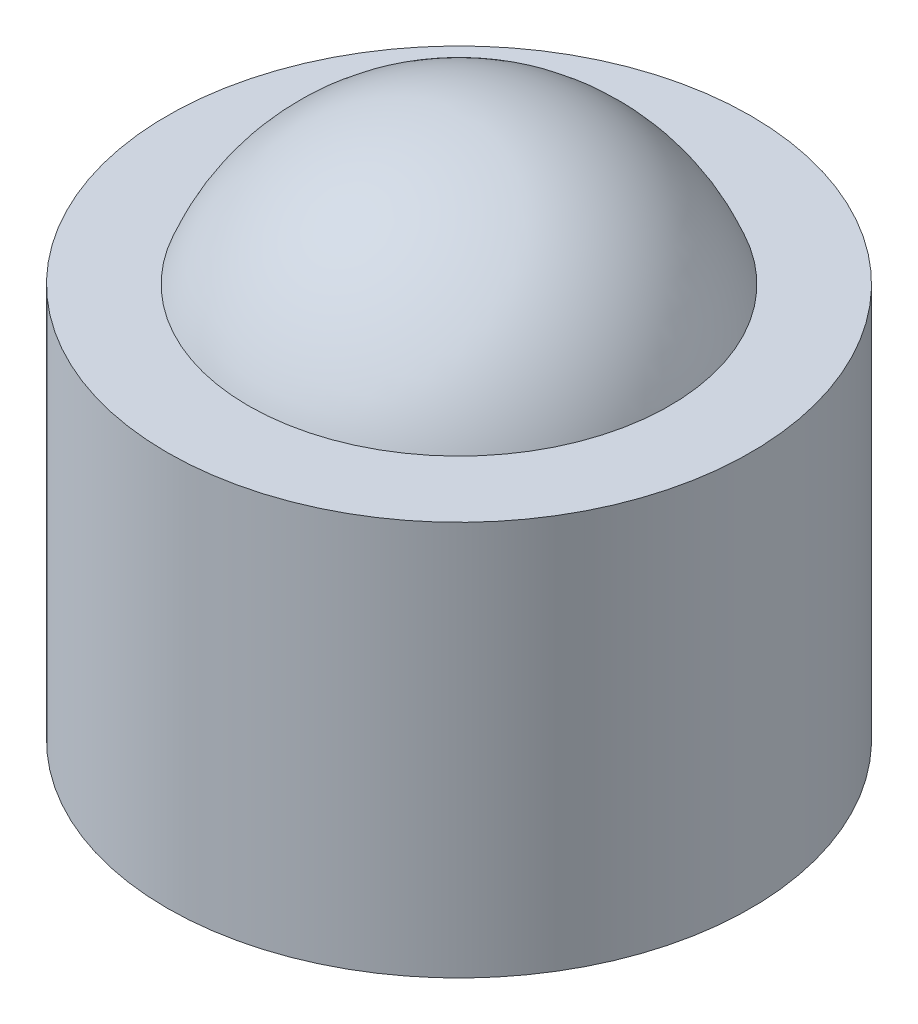
ISO-10303-21;
HEADER;
FILE_DESCRIPTION(('STEP AP214'),'2;1');
FILE_NAME('part.step','',(''),(''),'','','');
FILE_SCHEMA(('AUTOMOTIVE_DESIGN { 1 0 10303 214 1 1 1 1 }'));
ENDSEC;
DATA;
#1=APPLICATION_CONTEXT('core data for automotive mechanical design processes');
#2=APPLICATION_PROTOCOL_DEFINITION('international standard','automotive_design',2000,#1);
#3=PRODUCT_CONTEXT('',#1,'mechanical');
#4=PRODUCT('Part','Part','',(#3));
#5=PRODUCT_RELATED_PRODUCT_CATEGORY('part','',(#4));
#6=PRODUCT_DEFINITION_FORMATION('','',#4);
#7=PRODUCT_DEFINITION_CONTEXT('part definition',#1,'design');
#8=PRODUCT_DEFINITION('design','',#6,#7);
#9=PRODUCT_DEFINITION_SHAPE('','',#8);
#10=(LENGTH_UNIT() NAMED_UNIT(*) SI_UNIT(.MILLI.,.METRE.));
#11=(NAMED_UNIT(*) PLANE_ANGLE_UNIT() SI_UNIT($,.RADIAN.));
#12=(NAMED_UNIT(*) SI_UNIT($,.STERADIAN.) SOLID_ANGLE_UNIT());
#13=UNCERTAINTY_MEASURE_WITH_UNIT(LENGTH_MEASURE(1.E-05),#10,'distance_accuracy_value','');
#14=(GEOMETRIC_REPRESENTATION_CONTEXT(3) GLOBAL_UNCERTAINTY_ASSIGNED_CONTEXT((#13)) GLOBAL_UNIT_ASSIGNED_CONTEXT((#10,
#11,#12)) REPRESENTATION_CONTEXT('',''));
#15=CARTESIAN_POINT('',(0.,0.,0.));
#16=DIRECTION('',(0.,0.,1.));
#17=DIRECTION('',(1.,0.,0.));
#18=AXIS2_PLACEMENT_3D('',#15,#16,#17);
#19=CARTESIAN_POINT('',(0.,1.68688971918142,0.));
#20=DIRECTION('',(0.,-1.,0.));
#21=DIRECTION('',(-1.,0.,0.));
#22=AXIS2_PLACEMENT_3D('',#19,#20,#21);
#23=SPHERICAL_SURFACE('',#22,8.39808);
#24=CARTESIAN_POINT('',(0.,4.64176971918142,0.));
#25=DIRECTION('',(0.,1.,0.));
#26=DIRECTION('',(0.,0.,1.));
#27=AXIS2_PLACEMENT_3D('',#24,#25,#26);
#28=CIRCLE('',#27,7.86107065685076);
#29=CARTESIAN_POINT('',(0.,4.64176971918142,7.86107065685076));
#30=VERTEX_POINT('',#29);
#31=EDGE_CURVE('E10',#30,#30,#28,.F.);
#32=ORIENTED_EDGE('',*,*,#31,.F.);
#33=EDGE_LOOP('',(#32));
#34=FACE_BOUND('',#33,.T.);
#35=ADVANCED_FACE('F36',(#34),#23,.T.);
#36=CARTESIAN_POINT('',(10.8864,4.64176971918142,0.));
#37=DIRECTION('',(0.,1.,0.));
#38=DIRECTION('',(0.,0.,1.));
#39=AXIS2_PLACEMENT_3D('',#36,#37,#38);
#40=PLANE('',#39);
#41=ORIENTED_EDGE('',*,*,#31,.T.);
#42=EDGE_LOOP('',(#41));
#43=FACE_BOUND('',#42,.T.);
#44=CARTESIAN_POINT('',(0.,4.64176971918142,0.));
#45=DIRECTION('',(0.,-1.,0.));
#46=DIRECTION('',(0.,0.,-1.));
#47=AXIS2_PLACEMENT_3D('',#44,#45,#46);
#48=CIRCLE('',#47,10.8864);
#49=CARTESIAN_POINT('',(0.,4.64176971918142,-10.8864));
#50=VERTEX_POINT('',#49);
#51=EDGE_CURVE('E42',#50,#50,#48,.T.);
#52=ORIENTED_EDGE('',*,*,#51,.F.);
#53=EDGE_LOOP('',(#52));
#54=FACE_BOUND('',#53,.T.);
#55=ADVANCED_FACE('F57',(#43,#54),#40,.T.);
#56=CARTESIAN_POINT('',(0.,-10.0860634328896,0.));
#57=DIRECTION('',(0.,-1.,0.));
#58=DIRECTION('',(0.,0.,-1.));
#59=AXIS2_PLACEMENT_3D('',#56,#57,#58);
#60=CYLINDRICAL_SURFACE('',#59,10.8864);
#61=ORIENTED_EDGE('',*,*,#51,.T.);
#62=EDGE_LOOP('',(#61));
#63=FACE_BOUND('',#62,.T.);
#64=CARTESIAN_POINT('',(0.,-10.0860634328896,0.));
#65=DIRECTION('',(0.,-1.,0.));
#66=DIRECTION('',(0.,0.,-1.));
#67=AXIS2_PLACEMENT_3D('',#64,#65,#66);
#68=CIRCLE('',#67,10.8864);
#69=CARTESIAN_POINT('',(0.,-10.0860634328896,-10.8864));
#70=VERTEX_POINT('',#69);
#71=EDGE_CURVE('E46',#70,#70,#68,.T.);
#72=ORIENTED_EDGE('',*,*,#71,.F.);
#73=EDGE_LOOP('',(#72));
#74=FACE_BOUND('',#73,.T.);
#75=ADVANCED_FACE('F55',(#63,#74),#60,.T.);
#76=CARTESIAN_POINT('',(10.8864,-10.0860634328896,0.));
#77=DIRECTION('',(0.,-1.,0.));
#78=DIRECTION('',(0.,0.,-1.));
#79=AXIS2_PLACEMENT_3D('',#76,#77,#78);
#80=PLANE('',#79);
#81=ORIENTED_EDGE('',*,*,#71,.T.);
#82=EDGE_LOOP('',(#81));
#83=FACE_BOUND('',#82,.T.);
#84=ADVANCED_FACE('F53',(#83),#80,.T.);
#85=CLOSED_SHELL('',(#35,#55,#75,#84));
#86=MANIFOLD_SOLID_BREP('B2',#85);
#87=ADVANCED_BREP_SHAPE_REPRESENTATION('',(#18,#86),#14);
#88=SHAPE_DEFINITION_REPRESENTATION(#9,#87);
ENDSEC;
END-ISO-10303-21;
